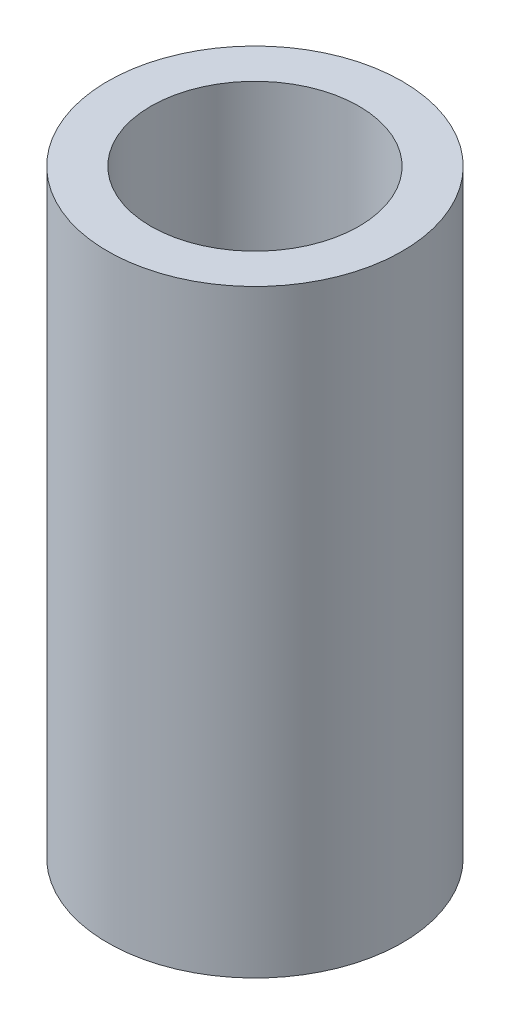
ISO-10303-21;
HEADER;
FILE_DESCRIPTION(('STEP AP214'),'2;1');
FILE_NAME('part.step','',(''),(''),'','','');
FILE_SCHEMA(('AUTOMOTIVE_DESIGN { 1 0 10303 214 1 1 1 1 }'));
ENDSEC;
DATA;
#1=APPLICATION_CONTEXT('core data for automotive mechanical design processes');
#2=APPLICATION_PROTOCOL_DEFINITION('international standard','automotive_design',2000,#1);
#3=PRODUCT_CONTEXT('',#1,'mechanical');
#4=PRODUCT('Part','Part','',(#3));
#5=PRODUCT_RELATED_PRODUCT_CATEGORY('part','',(#4));
#6=PRODUCT_DEFINITION_FORMATION('','',#4);
#7=PRODUCT_DEFINITION_CONTEXT('part definition',#1,'design');
#8=PRODUCT_DEFINITION('design','',#6,#7);
#9=PRODUCT_DEFINITION_SHAPE('','',#8);
#10=(LENGTH_UNIT() NAMED_UNIT(*) SI_UNIT(.MILLI.,.METRE.));
#11=(NAMED_UNIT(*) PLANE_ANGLE_UNIT() SI_UNIT($,.RADIAN.));
#12=(NAMED_UNIT(*) SI_UNIT($,.STERADIAN.) SOLID_ANGLE_UNIT());
#13=UNCERTAINTY_MEASURE_WITH_UNIT(LENGTH_MEASURE(1.E-05),#10,'distance_accuracy_value','');
#14=(GEOMETRIC_REPRESENTATION_CONTEXT(3) GLOBAL_UNCERTAINTY_ASSIGNED_CONTEXT((#13)) GLOBAL_UNIT_ASSIGNED_CONTEXT((#10,
#11,#12)) REPRESENTATION_CONTEXT('',''));
#15=CARTESIAN_POINT('',(0.,0.,0.));
#16=DIRECTION('',(0.,0.,1.));
#17=DIRECTION('',(1.,0.,0.));
#18=AXIS2_PLACEMENT_3D('',#15,#16,#17);
#19=CARTESIAN_POINT('',(0.,30.5,0.));
#20=DIRECTION('',(0.,-1.,0.));
#21=DIRECTION('',(0.,0.,-1.));
#22=AXIS2_PLACEMENT_3D('',#19,#20,#21);
#23=CYLINDRICAL_SURFACE('',#22,7.5);
#24=CARTESIAN_POINT('',(0.,30.5,0.));
#25=DIRECTION('',(0.,1.,0.));
#26=DIRECTION('',(0.,0.,1.));
#27=AXIS2_PLACEMENT_3D('',#24,#25,#26);
#28=CIRCLE('',#27,7.5);
#29=CARTESIAN_POINT('',(0.,30.5,-7.5));
#30=VERTEX_POINT('',#29);
#31=EDGE_CURVE('E10',#30,#30,#28,.T.);
#32=CARTESIAN_POINT('',(0.,0.,0.));
#33=DIRECTION('',(0.,1.,0.));
#34=DIRECTION('',(0.,0.,1.));
#35=AXIS2_PLACEMENT_3D('',#32,#33,#34);
#36=CIRCLE('',#35,7.5);
#37=CARTESIAN_POINT('',(0.,0.,-7.5));
#38=VERTEX_POINT('',#37);
#39=EDGE_CURVE('E38',#38,#38,#36,.T.);
#40=CARTESIAN_POINT('',(0.,30.5,-7.5));
#41=CARTESIAN_POINT('',(0.,30.1822916666667,-7.5));
#42=CARTESIAN_POINT('',(0.,29.8645833333333,-7.5));
#43=CARTESIAN_POINT('',(0.,29.2291666666667,-7.5));
#44=CARTESIAN_POINT('',(0.,28.9114583333333,-7.5));
#45=CARTESIAN_POINT('',(0.,28.2760416666667,-7.5));
#46=CARTESIAN_POINT('',(0.,27.9583333333333,-7.5));
#47=CARTESIAN_POINT('',(0.,27.3229166666667,-7.5));
#48=CARTESIAN_POINT('',(0.,27.0052083333333,-7.5));
#49=CARTESIAN_POINT('',(0.,26.3697916666667,-7.5));
#50=CARTESIAN_POINT('',(0.,26.0520833333333,-7.5));
#51=CARTESIAN_POINT('',(0.,25.4166666666667,-7.5));
#52=CARTESIAN_POINT('',(0.,25.0989583333333,-7.5));
#53=CARTESIAN_POINT('',(0.,24.4635416666667,-7.5));
#54=CARTESIAN_POINT('',(0.,24.1458333333333,-7.5));
#55=CARTESIAN_POINT('',(0.,23.5104166666667,-7.5));
#56=CARTESIAN_POINT('',(0.,23.1927083333333,-7.5));
#57=CARTESIAN_POINT('',(0.,22.5572916666667,-7.5));
#58=CARTESIAN_POINT('',(0.,22.2395833333333,-7.5));
#59=CARTESIAN_POINT('',(0.,21.6041666666667,-7.5));
#60=CARTESIAN_POINT('',(0.,21.2864583333333,-7.5));
#61=CARTESIAN_POINT('',(0.,20.6510416666667,-7.5));
#62=CARTESIAN_POINT('',(0.,20.3333333333333,-7.5));
#63=CARTESIAN_POINT('',(0.,19.6979166666667,-7.5));
#64=CARTESIAN_POINT('',(0.,19.3802083333333,-7.5));
#65=CARTESIAN_POINT('',(0.,18.7447916666667,-7.5));
#66=CARTESIAN_POINT('',(0.,18.4270833333333,-7.5));
#67=CARTESIAN_POINT('',(0.,17.7916666666667,-7.5));
#68=CARTESIAN_POINT('',(0.,17.4739583333333,-7.5));
#69=CARTESIAN_POINT('',(0.,16.8385416666667,-7.5));
#70=CARTESIAN_POINT('',(0.,16.5208333333333,-7.5));
#71=CARTESIAN_POINT('',(0.,15.8854166666667,-7.5));
#72=CARTESIAN_POINT('',(0.,15.5677083333333,-7.5));
#73=CARTESIAN_POINT('',(0.,14.9322916666667,-7.5));
#74=CARTESIAN_POINT('',(0.,14.6145833333333,-7.5));
#75=CARTESIAN_POINT('',(0.,13.9791666666667,-7.5));
#76=CARTESIAN_POINT('',(0.,13.6614583333333,-7.5));
#77=CARTESIAN_POINT('',(0.,13.0260416666667,-7.5));
#78=CARTESIAN_POINT('',(0.,12.7083333333333,-7.5));
#79=CARTESIAN_POINT('',(0.,12.0729166666667,-7.5));
#80=CARTESIAN_POINT('',(0.,11.7552083333333,-7.5));
#81=CARTESIAN_POINT('',(0.,11.1197916666667,-7.5));
#82=CARTESIAN_POINT('',(0.,10.8020833333333,-7.5));
#83=CARTESIAN_POINT('',(0.,10.1666666666667,-7.5));
#84=CARTESIAN_POINT('',(0.,9.84895833333333,-7.5));
#85=CARTESIAN_POINT('',(0.,9.21354166666666,-7.5));
#86=CARTESIAN_POINT('',(0.,8.89583333333333,-7.5));
#87=CARTESIAN_POINT('',(0.,8.26041666666666,-7.5));
#88=CARTESIAN_POINT('',(0.,7.94270833333333,-7.5));
#89=CARTESIAN_POINT('',(0.,7.30729166666666,-7.5));
#90=CARTESIAN_POINT('',(0.,6.98958333333333,-7.5));
#91=CARTESIAN_POINT('',(0.,6.35416666666666,-7.5));
#92=CARTESIAN_POINT('',(0.,6.03645833333333,-7.5));
#93=CARTESIAN_POINT('',(0.,5.40104166666666,-7.5));
#94=CARTESIAN_POINT('',(0.,5.08333333333333,-7.5));
#95=CARTESIAN_POINT('',(0.,4.44791666666666,-7.5));
#96=CARTESIAN_POINT('',(0.,4.13020833333333,-7.5));
#97=CARTESIAN_POINT('',(0.,3.49479166666666,-7.5));
#98=CARTESIAN_POINT('',(0.,3.17708333333333,-7.5));
#99=CARTESIAN_POINT('',(0.,2.54166666666666,-7.5));
#100=CARTESIAN_POINT('',(0.,2.22395833333333,-7.5));
#101=CARTESIAN_POINT('',(0.,1.58854166666666,-7.5));
#102=CARTESIAN_POINT('',(0.,1.27083333333333,-7.5));
#103=CARTESIAN_POINT('',(0.,0.635416666666662,-7.5));
#104=CARTESIAN_POINT('',(0.,0.317708333333329,-7.5));
#105=CARTESIAN_POINT('',(0.,0.,-7.5));
#106=B_SPLINE_CURVE_WITH_KNOTS('',3,(#40,#41,#42,#43,#44,#45,#46,#47,#48,#49,#50,#51,#52,#53,
#54,#55,#56,#57,#58,#59,#60,#61,#62,#63,#64,#65,#66,#67,#68,#69,#70,#71,#72,#73,#74,#75,#76,#77,
#78,#79,#80,#81,#82,#83,#84,#85,#86,#87,#88,#89,#90,#91,#92,#93,#94,#95,#96,#97,#98,#99,#100,
#101,#102,#103,#104,#105),.UNSPECIFIED.,.F.,.F.,(4,2,2,2,2,2,2,2,2,2,2,2,2,2,2,2,2,2,2,2,2,2,2,
2,2,2,2,2,2,2,2,2,4),(0.,0.953124999999999,1.90625,2.859375,3.8125,4.765625,5.71875,6.671875,
7.625,8.57812499999999,9.53125,10.484375,11.4375,12.390625,13.34375,14.296875,15.25,16.203125,
17.15625,18.109375,19.0625,20.015625,20.96875,21.921875,22.875,23.828125,24.78125,25.734375,
26.6875,27.640625,28.59375,29.546875,30.5),.UNSPECIFIED.);
#107=EDGE_CURVE('BSEAM35',#30,#38,#106,.T.);
#108=ORIENTED_EDGE('',*,*,#31,.F.);
#109=ORIENTED_EDGE('',*,*,#39,.T.);
#110=ORIENTED_EDGE('',*,*,#107,.T.);
#111=ORIENTED_EDGE('',*,*,#107,.F.);
#112=EDGE_LOOP('',(#108,#110,#109,#111));
#113=FACE_BOUND('',#112,.T.);
#114=ADVANCED_FACE('F35',(#113),#23,.T.);
#115=CARTESIAN_POINT('',(0.,30.5,0.));
#116=DIRECTION('',(0.,1.,0.));
#117=DIRECTION('',(0.,0.,1.));
#118=AXIS2_PLACEMENT_3D('',#115,#116,#117);
#119=PLANE('',#118);
#120=CARTESIAN_POINT('',(0.,30.5,0.));
#121=DIRECTION('',(0.,1.,0.));
#122=DIRECTION('',(0.,0.,1.));
#123=AXIS2_PLACEMENT_3D('',#120,#121,#122);
#124=CIRCLE('',#123,5.3);
#125=CARTESIAN_POINT('',(0.,30.5,5.3));
#126=VERTEX_POINT('',#125);
#127=EDGE_CURVE('E47',#126,#126,#124,.T.);
#128=ORIENTED_EDGE('',*,*,#127,.F.);
#129=EDGE_LOOP('',(#128));
#130=FACE_BOUND('',#129,.T.);
#131=ORIENTED_EDGE('',*,*,#31,.T.);
#132=EDGE_LOOP('',(#131));
#133=FACE_BOUND('',#132,.T.);
#134=ADVANCED_FACE('F62',(#130,#133),#119,.T.);
#135=CARTESIAN_POINT('',(0.,0.,0.));
#136=DIRECTION('',(0.,1.,0.));
#137=DIRECTION('',(0.,0.,1.));
#138=AXIS2_PLACEMENT_3D('',#135,#136,#137);
#139=PLANE('',#138);
#140=CARTESIAN_POINT('',(0.,0.,0.));
#141=DIRECTION('',(0.,1.,0.));
#142=DIRECTION('',(0.,0.,1.));
#143=AXIS2_PLACEMENT_3D('',#140,#141,#142);
#144=CIRCLE('',#143,5.3);
#145=CARTESIAN_POINT('',(0.,0.,5.3));
#146=VERTEX_POINT('',#145);
#147=EDGE_CURVE('E45',#146,#146,#144,.T.);
#148=ORIENTED_EDGE('',*,*,#147,.T.);
#149=EDGE_LOOP('',(#148));
#150=FACE_BOUND('',#149,.T.);
#151=ORIENTED_EDGE('',*,*,#39,.F.);
#152=EDGE_LOOP('',(#151));
#153=FACE_BOUND('',#152,.T.);
#154=ADVANCED_FACE('F53',(#150,#153),#139,.F.);
#155=CARTESIAN_POINT('',(0.,0.,0.));
#156=DIRECTION('',(0.,1.,0.));
#157=DIRECTION('',(0.,0.,1.));
#158=AXIS2_PLACEMENT_3D('',#155,#156,#157);
#159=CYLINDRICAL_SURFACE('',#158,5.3);
#160=CARTESIAN_POINT('',(0.,0.,5.3));
#161=CARTESIAN_POINT('',(0.,0.317708333333333,5.3));
#162=CARTESIAN_POINT('',(0.,0.635416666666667,5.3));
#163=CARTESIAN_POINT('',(0.,1.27083333333333,5.3));
#164=CARTESIAN_POINT('',(0.,1.58854166666667,5.3));
#165=CARTESIAN_POINT('',(0.,2.22395833333333,5.3));
#166=CARTESIAN_POINT('',(0.,2.54166666666667,5.3));
#167=CARTESIAN_POINT('',(0.,3.17708333333333,5.3));
#168=CARTESIAN_POINT('',(0.,3.49479166666667,5.3));
#169=CARTESIAN_POINT('',(0.,4.13020833333333,5.3));
#170=CARTESIAN_POINT('',(0.,4.44791666666667,5.3));
#171=CARTESIAN_POINT('',(0.,5.08333333333333,5.3));
#172=CARTESIAN_POINT('',(0.,5.40104166666667,5.3));
#173=CARTESIAN_POINT('',(0.,6.03645833333333,5.3));
#174=CARTESIAN_POINT('',(0.,6.35416666666667,5.3));
#175=CARTESIAN_POINT('',(0.,6.98958333333333,5.3));
#176=CARTESIAN_POINT('',(0.,7.30729166666667,5.3));
#177=CARTESIAN_POINT('',(0.,7.94270833333333,5.3));
#178=CARTESIAN_POINT('',(0.,8.26041666666666,5.3));
#179=CARTESIAN_POINT('',(0.,8.89583333333333,5.3));
#180=CARTESIAN_POINT('',(0.,9.21354166666666,5.3));
#181=CARTESIAN_POINT('',(0.,9.84895833333333,5.3));
#182=CARTESIAN_POINT('',(0.,10.1666666666667,5.3));
#183=CARTESIAN_POINT('',(0.,10.8020833333333,5.3));
#184=CARTESIAN_POINT('',(0.,11.1197916666667,5.3));
#185=CARTESIAN_POINT('',(0.,11.7552083333333,5.3));
#186=CARTESIAN_POINT('',(0.,12.0729166666667,5.3));
#187=CARTESIAN_POINT('',(0.,12.7083333333333,5.3));
#188=CARTESIAN_POINT('',(0.,13.0260416666667,5.3));
#189=CARTESIAN_POINT('',(0.,13.6614583333333,5.3));
#190=CARTESIAN_POINT('',(0.,13.9791666666667,5.3));
#191=CARTESIAN_POINT('',(0.,14.6145833333333,5.3));
#192=CARTESIAN_POINT('',(0.,14.9322916666667,5.3));
#193=CARTESIAN_POINT('',(0.,15.5677083333333,5.3));
#194=CARTESIAN_POINT('',(0.,15.8854166666667,5.3));
#195=CARTESIAN_POINT('',(0.,16.5208333333333,5.3));
#196=CARTESIAN_POINT('',(0.,16.8385416666667,5.3));
#197=CARTESIAN_POINT('',(0.,17.4739583333333,5.3));
#198=CARTESIAN_POINT('',(0.,17.7916666666667,5.3));
#199=CARTESIAN_POINT('',(0.,18.4270833333333,5.3));
#200=CARTESIAN_POINT('',(0.,18.7447916666667,5.3));
#201=CARTESIAN_POINT('',(0.,19.3802083333333,5.3));
#202=CARTESIAN_POINT('',(0.,19.6979166666667,5.3));
#203=CARTESIAN_POINT('',(0.,20.3333333333333,5.3));
#204=CARTESIAN_POINT('',(0.,20.6510416666667,5.3));
#205=CARTESIAN_POINT('',(0.,21.2864583333333,5.3));
#206=CARTESIAN_POINT('',(0.,21.6041666666667,5.3));
#207=CARTESIAN_POINT('',(0.,22.2395833333333,5.3));
#208=CARTESIAN_POINT('',(0.,22.5572916666667,5.3));
#209=CARTESIAN_POINT('',(0.,23.1927083333333,5.3));
#210=CARTESIAN_POINT('',(0.,23.5104166666667,5.3));
#211=CARTESIAN_POINT('',(0.,24.1458333333333,5.3));
#212=CARTESIAN_POINT('',(0.,24.4635416666667,5.3));
#213=CARTESIAN_POINT('',(0.,25.0989583333333,5.3));
#214=CARTESIAN_POINT('',(0.,25.4166666666667,5.3));
#215=CARTESIAN_POINT('',(0.,26.0520833333333,5.3));
#216=CARTESIAN_POINT('',(0.,26.3697916666667,5.3));
#217=CARTESIAN_POINT('',(0.,27.0052083333333,5.3));
#218=CARTESIAN_POINT('',(0.,27.3229166666667,5.3));
#219=CARTESIAN_POINT('',(0.,27.9583333333333,5.3));
#220=CARTESIAN_POINT('',(0.,28.2760416666667,5.3));
#221=CARTESIAN_POINT('',(0.,28.9114583333333,5.3));
#222=CARTESIAN_POINT('',(0.,29.2291666666667,5.3));
#223=CARTESIAN_POINT('',(0.,29.8645833333333,5.3));
#224=CARTESIAN_POINT('',(0.,30.1822916666667,5.3));
#225=CARTESIAN_POINT('',(0.,30.5,5.3));
#226=B_SPLINE_CURVE_WITH_KNOTS('',3,(#160,#161,#162,#163,#164,#165,#166,#167,#168,#169,#170,
#171,#172,#173,#174,#175,#176,#177,#178,#179,#180,#181,#182,#183,#184,#185,#186,#187,#188,#189,
#190,#191,#192,#193,#194,#195,#196,#197,#198,#199,#200,#201,#202,#203,#204,#205,#206,#207,#208,
#209,#210,#211,#212,#213,#214,#215,#216,#217,#218,#219,#220,#221,#222,#223,#224,#225),
.UNSPECIFIED.,.F.,.F.,(4,2,2,2,2,2,2,2,2,2,2,2,2,2,2,2,2,2,2,2,2,2,2,2,2,2,2,2,2,2,2,2,4),(0.,
0.953125,1.90625,2.859375,3.8125,4.765625,5.71875,6.671875,7.625,8.578125,9.53125,10.484375,
11.4375,12.390625,13.34375,14.296875,15.25,16.203125,17.15625,18.109375,19.0625,20.015625,
20.96875,21.921875,22.875,23.828125,24.78125,25.734375,26.6875,27.640625,28.59375,29.546875,
30.5),.UNSPECIFIED.);
#227=EDGE_CURVE('BSEAM56',#146,#126,#226,.T.);
#228=ORIENTED_EDGE('',*,*,#147,.F.);
#229=ORIENTED_EDGE('',*,*,#127,.T.);
#230=ORIENTED_EDGE('',*,*,#227,.T.);
#231=ORIENTED_EDGE('',*,*,#227,.F.);
#232=EDGE_LOOP('',(#228,#230,#229,#231));
#233=FACE_BOUND('',#232,.T.);
#234=ADVANCED_FACE('F56',(#233),#159,.F.);
#235=CLOSED_SHELL('',(#114,#134,#154,#234));
#236=MANIFOLD_SOLID_BREP('B2',#235);
#237=ADVANCED_BREP_SHAPE_REPRESENTATION('',(#18,#236),#14);
#238=SHAPE_DEFINITION_REPRESENTATION(#9,#237);
ENDSEC;
END-ISO-10303-21;
